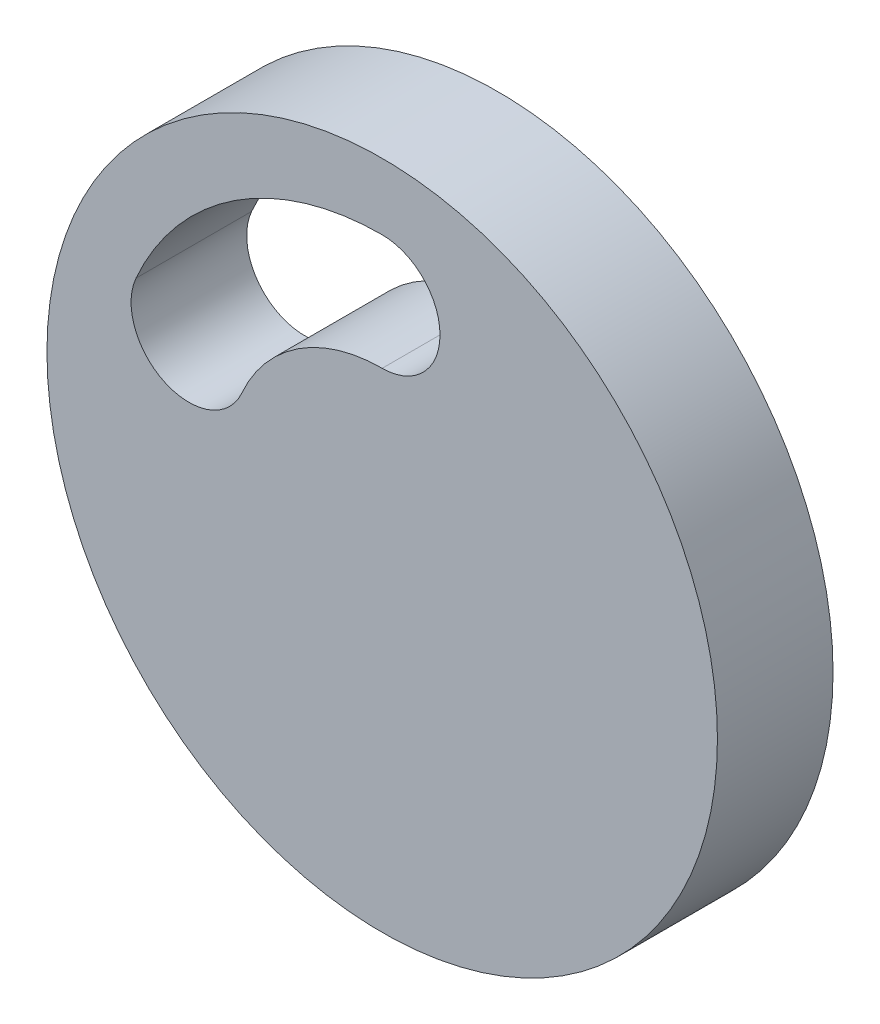
ISO-10303-21;
HEADER;
FILE_DESCRIPTION(('STEP AP214'),'2;1');
FILE_NAME('part.step','',(''),(''),'','','');
FILE_SCHEMA(('AUTOMOTIVE_DESIGN { 1 0 10303 214 1 1 1 1 }'));
ENDSEC;
DATA;
#1=APPLICATION_CONTEXT('core data for automotive mechanical design processes');
#2=APPLICATION_PROTOCOL_DEFINITION('international standard','automotive_design',2000,#1);
#3=PRODUCT_CONTEXT('',#1,'mechanical');
#4=PRODUCT('Part','Part','',(#3));
#5=PRODUCT_RELATED_PRODUCT_CATEGORY('part','',(#4));
#6=PRODUCT_DEFINITION_FORMATION('','',#4);
#7=PRODUCT_DEFINITION_CONTEXT('part definition',#1,'design');
#8=PRODUCT_DEFINITION('design','',#6,#7);
#9=PRODUCT_DEFINITION_SHAPE('','',#8);
#10=(LENGTH_UNIT() NAMED_UNIT(*) SI_UNIT(.MILLI.,.METRE.));
#11=(NAMED_UNIT(*) PLANE_ANGLE_UNIT() SI_UNIT($,.RADIAN.));
#12=(NAMED_UNIT(*) SI_UNIT($,.STERADIAN.) SOLID_ANGLE_UNIT());
#13=UNCERTAINTY_MEASURE_WITH_UNIT(LENGTH_MEASURE(1.E-05),#10,'distance_accuracy_value','');
#14=(GEOMETRIC_REPRESENTATION_CONTEXT(3) GLOBAL_UNCERTAINTY_ASSIGNED_CONTEXT((#13)) GLOBAL_UNIT_ASSIGNED_CONTEXT((#10,
#11,#12)) REPRESENTATION_CONTEXT('',''));
#15=CARTESIAN_POINT('',(0.,0.,0.));
#16=DIRECTION('',(0.,0.,1.));
#17=DIRECTION('',(1.,0.,0.));
#18=AXIS2_PLACEMENT_3D('',#15,#16,#17);
#19=CARTESIAN_POINT('',(0.,0.,1.));
#20=DIRECTION('',(0.,0.,1.));
#21=DIRECTION('',(1.,0.,0.));
#22=AXIS2_PLACEMENT_3D('',#19,#20,#21);
#23=PLANE('',#22);
#24=CARTESIAN_POINT('',(0.,0.,1.));
#25=DIRECTION('',(0.,0.,1.));
#26=DIRECTION('',(1.,0.,0.));
#27=AXIS2_PLACEMENT_3D('',#24,#25,#26);
#28=CIRCLE('',#27,2.89993584196307);
#29=CARTESIAN_POINT('',(2.89993584196307,0.,1.));
#30=VERTEX_POINT('',#29);
#31=EDGE_CURVE('E11',#30,#30,#28,.T.);
#32=ORIENTED_EDGE('',*,*,#31,.T.);
#33=EDGE_LOOP('',(#32));
#34=FACE_BOUND('',#33,.T.);
#35=CARTESIAN_POINT('',(0.,0.,1.));
#36=DIRECTION('',(0.,0.,1.));
#37=DIRECTION('',(1.,0.,0.));
#38=AXIS2_PLACEMENT_3D('',#35,#36,#37);
#39=CIRCLE('',#38,2.32663040276338);
#40=CARTESIAN_POINT('',(0.,2.32663040276338,1.));
#41=VERTEX_POINT('',#40);
#42=CARTESIAN_POINT('',(-2.12976565653703,0.936646827410564,1.));
#43=VERTEX_POINT('',#42);
#44=EDGE_CURVE('E82',#41,#43,#39,.T.);
#45=ORIENTED_EDGE('',*,*,#44,.F.);
#46=CARTESIAN_POINT('',(0.,1.82663040276338,1.));
#47=DIRECTION('',(0.,0.,1.));
#48=DIRECTION('',(1.,0.,0.));
#49=AXIS2_PLACEMENT_3D('',#46,#47,#48);
#50=CIRCLE('',#49,0.5);
#51=CARTESIAN_POINT('',(0.,1.32663040276338,1.));
#52=VERTEX_POINT('',#51);
#53=EDGE_CURVE('E74',#52,#41,#50,.T.);
#54=ORIENTED_EDGE('',*,*,#53,.F.);
#55=CARTESIAN_POINT('',(0.,0.,1.));
#56=DIRECTION('',(0.,0.,-1.));
#57=DIRECTION('',(1.,0.,0.));
#58=AXIS2_PLACEMENT_3D('',#55,#56,#57);
#59=CIRCLE('',#58,1.32663040276338);
#60=CARTESIAN_POINT('',(-1.2143793304547,0.534070283109375,1.));
#61=VERTEX_POINT('',#60);
#62=EDGE_CURVE('E95',#61,#52,#59,.T.);
#63=ORIENTED_EDGE('',*,*,#62,.F.);
#64=CARTESIAN_POINT('',(-1.67207249349587,0.73535855525997,1.));
#65=DIRECTION('',(0.,0.,1.));
#66=DIRECTION('',(1.,0.,0.));
#67=AXIS2_PLACEMENT_3D('',#64,#65,#66);
#68=CIRCLE('',#67,0.5);
#69=EDGE_CURVE('E93',#43,#61,#68,.T.);
#70=ORIENTED_EDGE('',*,*,#69,.F.);
#71=EDGE_LOOP('',(#45,#54,#63,#70));
#72=FACE_BOUND('',#71,.T.);
#73=ADVANCED_FACE('F33',(#34,#72),#23,.T.);
#74=CARTESIAN_POINT('',(0.,0.,0.));
#75=DIRECTION('',(0.,0.,1.));
#76=DIRECTION('',(1.,0.,0.));
#77=AXIS2_PLACEMENT_3D('',#74,#75,#76);
#78=PLANE('',#77);
#79=CARTESIAN_POINT('',(0.,0.,0.));
#80=DIRECTION('',(0.,0.,1.));
#81=DIRECTION('',(1.,0.,0.));
#82=AXIS2_PLACEMENT_3D('',#79,#80,#81);
#83=CIRCLE('',#82,2.89993584196307);
#84=CARTESIAN_POINT('',(2.89993584196307,0.,0.));
#85=VERTEX_POINT('',#84);
#86=EDGE_CURVE('E37',#85,#85,#83,.T.);
#87=ORIENTED_EDGE('',*,*,#86,.F.);
#88=EDGE_LOOP('',(#87));
#89=FACE_BOUND('',#88,.T.);
#90=CARTESIAN_POINT('',(0.,1.82663040276338,0.));
#91=DIRECTION('',(0.,0.,1.));
#92=DIRECTION('',(1.,0.,0.));
#93=AXIS2_PLACEMENT_3D('',#90,#91,#92);
#94=CIRCLE('',#93,0.5);
#95=CARTESIAN_POINT('',(0.,1.32663040276338,0.));
#96=VERTEX_POINT('',#95);
#97=CARTESIAN_POINT('',(0.,2.32663040276338,0.));
#98=VERTEX_POINT('',#97);
#99=EDGE_CURVE('E56',#96,#98,#94,.T.);
#100=ORIENTED_EDGE('',*,*,#99,.T.);
#101=CARTESIAN_POINT('',(0.,0.,0.));
#102=DIRECTION('',(0.,0.,1.));
#103=DIRECTION('',(1.,0.,0.));
#104=AXIS2_PLACEMENT_3D('',#101,#102,#103);
#105=CIRCLE('',#104,2.32663040276338);
#106=CARTESIAN_POINT('',(-2.12976565653703,0.936646827410564,0.));
#107=VERTEX_POINT('',#106);
#108=EDGE_CURVE('E89',#98,#107,#105,.T.);
#109=ORIENTED_EDGE('',*,*,#108,.T.);
#110=CARTESIAN_POINT('',(-1.67207249349587,0.73535855525997,0.));
#111=DIRECTION('',(0.,0.,1.));
#112=DIRECTION('',(1.,0.,0.));
#113=AXIS2_PLACEMENT_3D('',#110,#111,#112);
#114=CIRCLE('',#113,0.5);
#115=CARTESIAN_POINT('',(-1.2143793304547,0.534070283109375,0.));
#116=VERTEX_POINT('',#115);
#117=EDGE_CURVE('E101',#107,#116,#114,.T.);
#118=ORIENTED_EDGE('',*,*,#117,.T.);
#119=CARTESIAN_POINT('',(0.,0.,0.));
#120=DIRECTION('',(0.,0.,-1.));
#121=DIRECTION('',(1.,0.,0.));
#122=AXIS2_PLACEMENT_3D('',#119,#120,#121);
#123=CIRCLE('',#122,1.32663040276338);
#124=EDGE_CURVE('E83',#116,#96,#123,.T.);
#125=ORIENTED_EDGE('',*,*,#124,.T.);
#126=EDGE_LOOP('',(#100,#109,#118,#125));
#127=FACE_BOUND('',#126,.T.);
#128=ADVANCED_FACE('F112',(#89,#127),#78,.F.);
#129=CARTESIAN_POINT('',(0.,0.,1.));
#130=DIRECTION('',(0.,0.,-1.));
#131=DIRECTION('',(-1.,0.,0.));
#132=AXIS2_PLACEMENT_3D('',#129,#130,#131);
#133=CYLINDRICAL_SURFACE('',#132,2.89993584196307);
#134=ORIENTED_EDGE('',*,*,#31,.F.);
#135=EDGE_LOOP('',(#134));
#136=FACE_BOUND('',#135,.T.);
#137=ORIENTED_EDGE('',*,*,#86,.T.);
#138=EDGE_LOOP('',(#137));
#139=FACE_BOUND('',#138,.T.);
#140=ADVANCED_FACE('F35',(#136,#139),#133,.T.);
#141=CARTESIAN_POINT('',(0.,1.82663040276338,1.));
#142=DIRECTION('',(0.,0.,-1.));
#143=DIRECTION('',(-1.,0.,0.));
#144=AXIS2_PLACEMENT_3D('',#141,#142,#143);
#145=CYLINDRICAL_SURFACE('',#144,0.5);
#146=ORIENTED_EDGE('',*,*,#99,.F.);
#147=DIRECTION('',(0.,0.,-1.));
#148=VECTOR('',#147,1.);
#149=CARTESIAN_POINT('',(0.,1.32663040276338,1.));
#150=LINE('',#149,#148);
#151=EDGE_CURVE('E78',#52,#96,#150,.T.);
#152=ORIENTED_EDGE('',*,*,#151,.F.);
#153=ORIENTED_EDGE('',*,*,#53,.T.);
#154=DIRECTION('',(0.,0.,-1.));
#155=VECTOR('',#154,1.);
#156=CARTESIAN_POINT('',(0.,2.32663040276338,1.));
#157=LINE('',#156,#155);
#158=EDGE_CURVE('E77',#41,#98,#157,.T.);
#159=ORIENTED_EDGE('',*,*,#158,.T.);
#160=EDGE_LOOP('',(#146,#152,#153,#159));
#161=FACE_BOUND('',#160,.T.);
#162=ADVANCED_FACE('F76',(#161),#145,.F.);
#163=CARTESIAN_POINT('',(0.,0.,1.));
#164=DIRECTION('',(0.,0.,-1.));
#165=DIRECTION('',(-1.,0.,0.));
#166=AXIS2_PLACEMENT_3D('',#163,#164,#165);
#167=CYLINDRICAL_SURFACE('',#166,2.32663040276338);
#168=ORIENTED_EDGE('',*,*,#108,.F.);
#169=ORIENTED_EDGE('',*,*,#158,.F.);
#170=ORIENTED_EDGE('',*,*,#44,.T.);
#171=DIRECTION('',(0.,0.,-1.));
#172=VECTOR('',#171,1.);
#173=CARTESIAN_POINT('',(-2.12976565653703,0.936646827410564,1.));
#174=LINE('',#173,#172);
#175=EDGE_CURVE('E90',#43,#107,#174,.T.);
#176=ORIENTED_EDGE('',*,*,#175,.T.);
#177=EDGE_LOOP('',(#168,#169,#170,#176));
#178=FACE_BOUND('',#177,.T.);
#179=ADVANCED_FACE('F86',(#178),#167,.F.);
#180=CARTESIAN_POINT('',(-1.67207249349587,0.73535855525997,1.));
#181=DIRECTION('',(0.,0.,-1.));
#182=DIRECTION('',(-1.,0.,0.));
#183=AXIS2_PLACEMENT_3D('',#180,#181,#182);
#184=CYLINDRICAL_SURFACE('',#183,0.5);
#185=ORIENTED_EDGE('',*,*,#117,.F.);
#186=ORIENTED_EDGE('',*,*,#175,.F.);
#187=ORIENTED_EDGE('',*,*,#69,.T.);
#188=DIRECTION('',(0.,0.,-1.));
#189=VECTOR('',#188,1.);
#190=CARTESIAN_POINT('',(-1.2143793304547,0.534070283109375,1.));
#191=LINE('',#190,#189);
#192=EDGE_CURVE('E48',#61,#116,#191,.T.);
#193=ORIENTED_EDGE('',*,*,#192,.T.);
#194=EDGE_LOOP('',(#185,#186,#187,#193));
#195=FACE_BOUND('',#194,.T.);
#196=ADVANCED_FACE('F110',(#195),#184,.F.);
#197=CARTESIAN_POINT('',(0.,0.,1.));
#198=DIRECTION('',(0.,0.,-1.));
#199=DIRECTION('',(-1.,0.,0.));
#200=AXIS2_PLACEMENT_3D('',#197,#198,#199);
#201=CYLINDRICAL_SURFACE('',#200,1.32663040276338);
#202=ORIENTED_EDGE('',*,*,#124,.F.);
#203=ORIENTED_EDGE('',*,*,#192,.F.);
#204=ORIENTED_EDGE('',*,*,#62,.T.);
#205=ORIENTED_EDGE('',*,*,#151,.T.);
#206=EDGE_LOOP('',(#202,#203,#204,#205));
#207=FACE_BOUND('',#206,.T.);
#208=ADVANCED_FACE('F113',(#207),#201,.T.);
#209=CLOSED_SHELL('',(#73,#128,#140,#162,#179,#196,#208));
#210=MANIFOLD_SOLID_BREP('B2',#209);
#211=ADVANCED_BREP_SHAPE_REPRESENTATION('',(#18,#210),#14);
#212=SHAPE_DEFINITION_REPRESENTATION(#9,#211);
ENDSEC;
END-ISO-10303-21;
